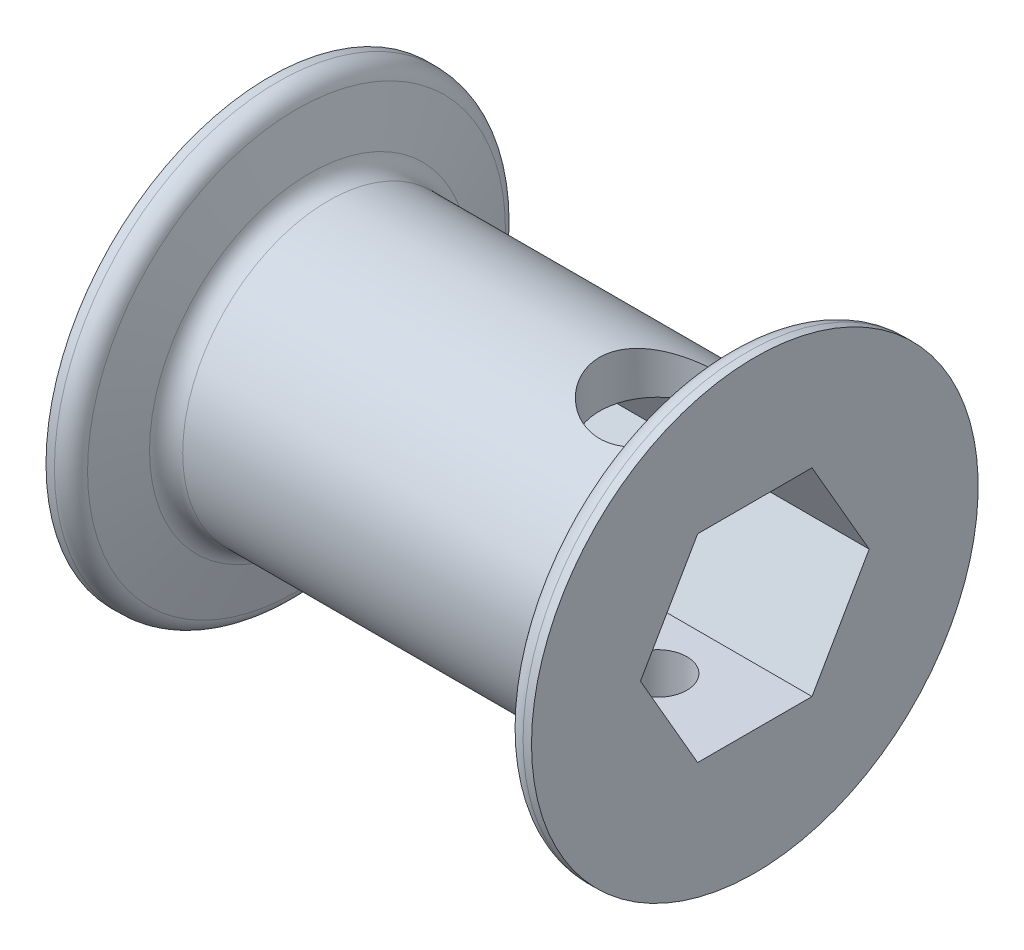
ISO-10303-21;
HEADER;
FILE_DESCRIPTION(('STEP AP214'),'2;1');
FILE_NAME('part.step','',(''),(''),'','','');
FILE_SCHEMA(('AUTOMOTIVE_DESIGN { 1 0 10303 214 1 1 1 1 }'));
ENDSEC;
DATA;
#1=APPLICATION_CONTEXT('core data for automotive mechanical design processes');
#2=APPLICATION_PROTOCOL_DEFINITION('international standard','automotive_design',2000,#1);
#3=PRODUCT_CONTEXT('',#1,'mechanical');
#4=PRODUCT('Part','Part','',(#3));
#5=PRODUCT_RELATED_PRODUCT_CATEGORY('part','',(#4));
#6=PRODUCT_DEFINITION_FORMATION('','',#4);
#7=PRODUCT_DEFINITION_CONTEXT('part definition',#1,'design');
#8=PRODUCT_DEFINITION('design','',#6,#7);
#9=PRODUCT_DEFINITION_SHAPE('','',#8);
#10=(LENGTH_UNIT() NAMED_UNIT(*) SI_UNIT(.MILLI.,.METRE.));
#11=(NAMED_UNIT(*) PLANE_ANGLE_UNIT() SI_UNIT($,.RADIAN.));
#12=(NAMED_UNIT(*) SI_UNIT($,.STERADIAN.) SOLID_ANGLE_UNIT());
#13=UNCERTAINTY_MEASURE_WITH_UNIT(LENGTH_MEASURE(1.E-05),#10,'distance_accuracy_value','');
#14=(GEOMETRIC_REPRESENTATION_CONTEXT(3) GLOBAL_UNCERTAINTY_ASSIGNED_CONTEXT((#13)) GLOBAL_UNIT_ASSIGNED_CONTEXT((#10,
#11,#12)) REPRESENTATION_CONTEXT('',''));
#15=CARTESIAN_POINT('',(0.,0.,0.));
#16=DIRECTION('',(0.,0.,1.));
#17=DIRECTION('',(1.,0.,0.));
#18=AXIS2_PLACEMENT_3D('',#15,#16,#17);
#19=CARTESIAN_POINT('',(31.75,6.477,3.7394976935412));
#20=DIRECTION('',(0.,1.,0.));
#21=DIRECTION('',(0.,0.,1.));
#22=AXIS2_PLACEMENT_3D('',#19,#20,#21);
#23=PLANE('',#22);
#24=DIRECTION('',(-1.,0.,0.));
#25=VECTOR('',#24,1.);
#26=CARTESIAN_POINT('',(31.75,6.477,3.7394976935412));
#27=LINE('',#26,#25);
#28=CARTESIAN_POINT('',(31.75,6.477,3.7394976935412));
#29=VERTEX_POINT('',#28);
#30=CARTESIAN_POINT('',(26.1295594561103,6.477,3.7394976935412));
#31=VERTEX_POINT('',#30);
#32=EDGE_CURVE('E243',#29,#31,#27,.T.);
#33=ORIENTED_EDGE('',*,*,#32,.T.);
#34=CARTESIAN_POINT('',(25.4,6.477,0.));
#35=DIRECTION('',(0.,1.,0.));
#36=DIRECTION('',(0.,0.,1.));
#37=AXIS2_PLACEMENT_3D('',#34,#35,#36);
#38=CIRCLE('',#37,3.81);
#39=CARTESIAN_POINT('',(26.1295594561103,6.477,-3.73949769354121));
#40=VERTEX_POINT('',#39);
#41=EDGE_CURVE('E54',#31,#40,#38,.T.);
#42=ORIENTED_EDGE('',*,*,#41,.T.);
#43=DIRECTION('',(-1.,0.,0.));
#44=VECTOR('',#43,1.);
#45=CARTESIAN_POINT('',(31.75,6.477,-3.73949769354121));
#46=LINE('',#45,#44);
#47=CARTESIAN_POINT('',(31.75,6.477,-3.73949769354121));
#48=VERTEX_POINT('',#47);
#49=EDGE_CURVE('E239',#48,#40,#46,.T.);
#50=ORIENTED_EDGE('',*,*,#49,.F.);
#51=DIRECTION('',(0.,0.,-1.));
#52=VECTOR('',#51,1.);
#53=CARTESIAN_POINT('',(31.75,6.477,3.7394976935412));
#54=LINE('',#53,#52);
#55=EDGE_CURVE('E204',#29,#48,#54,.T.);
#56=ORIENTED_EDGE('',*,*,#55,.F.);
#57=EDGE_LOOP('',(#33,#42,#50,#56));
#58=FACE_BOUND('',#57,.T.);
#59=ADVANCED_FACE('F37',(#58),#23,.F.);
#60=CARTESIAN_POINT('',(0.,14.605,0.));
#61=DIRECTION('',(1.,0.,0.));
#62=DIRECTION('',(0.,0.,-1.));
#63=AXIS2_PLACEMENT_3D('',#60,#61,#62);
#64=PLANE('',#63);
#65=DIRECTION('',(0.,0.866025403784438,-0.5));
#66=VECTOR('',#65,1.);
#67=CARTESIAN_POINT('',(0.,0.,7.47899538708241));
#68=LINE('',#67,#66);
#69=CARTESIAN_POINT('',(0.,0.,7.47899538708241));
#70=VERTEX_POINT('',#69);
#71=CARTESIAN_POINT('',(0.,6.477,3.7394976935412));
#72=VERTEX_POINT('',#71);
#73=EDGE_CURVE('E218',#70,#72,#68,.T.);
#74=ORIENTED_EDGE('',*,*,#73,.F.);
#75=DIRECTION('',(0.,0.866025403784439,0.5));
#76=VECTOR('',#75,1.);
#77=CARTESIAN_POINT('',(0.,-6.477,3.73949769354121));
#78=LINE('',#77,#76);
#79=CARTESIAN_POINT('',(0.,-6.477,3.73949769354121));
#80=VERTEX_POINT('',#79);
#81=EDGE_CURVE('E194',#80,#70,#78,.T.);
#82=ORIENTED_EDGE('',*,*,#81,.F.);
#83=DIRECTION('',(0.,0.,1.));
#84=VECTOR('',#83,1.);
#85=CARTESIAN_POINT('',(0.,-6.477,-3.73949769354121));
#86=LINE('',#85,#84);
#87=CARTESIAN_POINT('',(0.,-6.477,-3.73949769354121));
#88=VERTEX_POINT('',#87);
#89=EDGE_CURVE('E201',#88,#80,#86,.T.);
#90=ORIENTED_EDGE('',*,*,#89,.F.);
#91=DIRECTION('',(0.,-0.866025403784439,0.5));
#92=VECTOR('',#91,1.);
#93=CARTESIAN_POINT('',(0.,0.,-7.47899538708241));
#94=LINE('',#93,#92);
#95=CARTESIAN_POINT('',(0.,0.,-7.47899538708241));
#96=VERTEX_POINT('',#95);
#97=EDGE_CURVE('E227',#96,#88,#94,.T.);
#98=ORIENTED_EDGE('',*,*,#97,.F.);
#99=DIRECTION('',(0.,-0.866025403784439,-0.5));
#100=VECTOR('',#99,1.);
#101=CARTESIAN_POINT('',(0.,6.477,-3.73949769354121));
#102=LINE('',#101,#100);
#103=CARTESIAN_POINT('',(0.,6.477,-3.73949769354121));
#104=VERTEX_POINT('',#103);
#105=EDGE_CURVE('E224',#104,#96,#102,.T.);
#106=ORIENTED_EDGE('',*,*,#105,.F.);
#107=DIRECTION('',(0.,0.,-1.));
#108=VECTOR('',#107,1.);
#109=CARTESIAN_POINT('',(0.,6.477,3.7394976935412));
#110=LINE('',#109,#108);
#111=EDGE_CURVE('E221',#72,#104,#110,.T.);
#112=ORIENTED_EDGE('',*,*,#111,.F.);
#113=EDGE_LOOP('',(#74,#82,#90,#98,#106,#112));
#114=FACE_BOUND('',#113,.T.);
#115=CARTESIAN_POINT('',(0.,0.,0.));
#116=DIRECTION('',(-1.,0.,0.));
#117=DIRECTION('',(0.,0.,1.));
#118=AXIS2_PLACEMENT_3D('',#115,#116,#117);
#119=CIRCLE('',#118,14.605);
#120=CARTESIAN_POINT('',(0.,0.,14.605));
#121=VERTEX_POINT('',#120);
#122=EDGE_CURVE('E234',#121,#121,#119,.T.);
#123=ORIENTED_EDGE('',*,*,#122,.T.);
#124=EDGE_LOOP('',(#123));
#125=FACE_BOUND('',#124,.T.);
#126=ADVANCED_FACE('F271',(#114,#125),#64,.F.);
#127=CARTESIAN_POINT('',(31.75,0.,0.));
#128=DIRECTION('',(-1.,0.,0.));
#129=DIRECTION('',(0.,0.,1.));
#130=AXIS2_PLACEMENT_3D('',#127,#128,#129);
#131=PLANE('',#130);
#132=DIRECTION('',(0.,0.,1.));
#133=VECTOR('',#132,1.);
#134=CARTESIAN_POINT('',(31.75,-6.477,-3.73949769354121));
#135=LINE('',#134,#133);
#136=CARTESIAN_POINT('',(31.75,-6.477,-3.73949769354121));
#137=VERTEX_POINT('',#136);
#138=CARTESIAN_POINT('',(31.75,-6.477,3.73949769354121));
#139=VERTEX_POINT('',#138);
#140=EDGE_CURVE('E213',#137,#139,#135,.T.);
#141=ORIENTED_EDGE('',*,*,#140,.T.);
#142=DIRECTION('',(0.,0.866025403784439,0.5));
#143=VECTOR('',#142,1.);
#144=CARTESIAN_POINT('',(31.75,-6.477,3.73949769354121));
#145=LINE('',#144,#143);
#146=CARTESIAN_POINT('',(31.75,0.,7.47899538708241));
#147=VERTEX_POINT('',#146);
#148=EDGE_CURVE('E197',#139,#147,#145,.T.);
#149=ORIENTED_EDGE('',*,*,#148,.T.);
#150=DIRECTION('',(0.,0.866025403784438,-0.5));
#151=VECTOR('',#150,1.);
#152=CARTESIAN_POINT('',(31.75,0.,7.47899538708241));
#153=LINE('',#152,#151);
#154=EDGE_CURVE('E200',#147,#29,#153,.T.);
#155=ORIENTED_EDGE('',*,*,#154,.T.);
#156=ORIENTED_EDGE('',*,*,#55,.T.);
#157=DIRECTION('',(0.,-0.866025403784439,-0.5));
#158=VECTOR('',#157,1.);
#159=CARTESIAN_POINT('',(31.75,6.477,-3.73949769354121));
#160=LINE('',#159,#158);
#161=CARTESIAN_POINT('',(31.75,0.,-7.47899538708241));
#162=VERTEX_POINT('',#161);
#163=EDGE_CURVE('E207',#48,#162,#160,.T.);
#164=ORIENTED_EDGE('',*,*,#163,.T.);
#165=DIRECTION('',(0.,-0.866025403784439,0.5));
#166=VECTOR('',#165,1.);
#167=CARTESIAN_POINT('',(31.75,0.,-7.47899538708241));
#168=LINE('',#167,#166);
#169=EDGE_CURVE('E210',#162,#137,#168,.T.);
#170=ORIENTED_EDGE('',*,*,#169,.T.);
#171=EDGE_LOOP('',(#141,#149,#155,#156,#164,#170));
#172=FACE_BOUND('',#171,.T.);
#173=CARTESIAN_POINT('',(31.75,0.,0.));
#174=DIRECTION('',(-1.,0.,0.));
#175=DIRECTION('',(0.,0.,1.));
#176=AXIS2_PLACEMENT_3D('',#173,#174,#175);
#177=CIRCLE('',#176,14.605);
#178=CARTESIAN_POINT('',(31.75,0.,14.605));
#179=VERTEX_POINT('',#178);
#180=EDGE_CURVE('E251',#179,#179,#177,.T.);
#181=ORIENTED_EDGE('',*,*,#180,.F.);
#182=EDGE_LOOP('',(#181));
#183=FACE_BOUND('',#182,.T.);
#184=ADVANCED_FACE('F273',(#172,#183),#131,.F.);
#185=CARTESIAN_POINT('',(31.75,0.,0.));
#186=DIRECTION('',(-1.,0.,0.));
#187=DIRECTION('',(0.,0.,1.));
#188=AXIS2_PLACEMENT_3D('',#185,#186,#187);
#189=CYLINDRICAL_SURFACE('',#188,14.605);
#190=CARTESIAN_POINT('',(31.2005052747333,0.,0.));
#191=DIRECTION('',(1.,0.,0.));
#192=DIRECTION('',(0.,0.,-1.));
#193=AXIS2_PLACEMENT_3D('',#190,#191,#192);
#194=CIRCLE('',#193,14.605);
#195=CARTESIAN_POINT('',(31.2005052747333,0.,-14.605));
#196=VERTEX_POINT('',#195);
#197=EDGE_CURVE('E120',#196,#196,#194,.T.);
#198=ORIENTED_EDGE('',*,*,#197,.T.);
#199=EDGE_LOOP('',(#198));
#200=FACE_BOUND('',#199,.T.);
#201=ORIENTED_EDGE('',*,*,#180,.T.);
#202=EDGE_LOOP('',(#201));
#203=FACE_BOUND('',#202,.T.);
#204=ADVANCED_FACE('F280',(#200,#203),#189,.T.);
#205=CARTESIAN_POINT('',(30.226,0.,0.));
#206=DIRECTION('',(1.,0.,0.));
#207=DIRECTION('',(0.,0.,-1.));
#208=AXIS2_PLACEMENT_3D('',#205,#206,#207);
#209=CONICAL_SURFACE('',#208,14.605,1.30899693899575);
#210=CARTESIAN_POINT('',(29.9737794753462,0.,0.));
#211=DIRECTION('',(-1.,0.,0.));
#212=DIRECTION('',(0.,0.,1.));
#213=AXIS2_PLACEMENT_3D('',#210,#211,#212);
#214=CIRCLE('',#213,13.6637001872802);
#215=CARTESIAN_POINT('',(29.9737794753462,0.,13.6637001872802));
#216=VERTEX_POINT('',#215);
#217=EDGE_CURVE('E142',#216,#216,#214,.T.);
#218=ORIENTED_EDGE('',*,*,#217,.T.);
#219=EDGE_LOOP('',(#218));
#220=FACE_BOUND('',#219,.T.);
#221=CARTESIAN_POINT('',(29.1170386271038,0.,0.));
#222=DIRECTION('',(1.,0.,0.));
#223=DIRECTION('',(0.,0.,-1.));
#224=AXIS2_PLACEMENT_3D('',#221,#222,#223);
#225=CIRCLE('',#224,10.4662998127198);
#226=CARTESIAN_POINT('',(29.1170386271038,10.4328187909654,0.836494975847781));
#227=VERTEX_POINT('',#226);
#228=CARTESIAN_POINT('',(29.1170386271038,10.4328187909653,-0.836494975848145));
#229=VERTEX_POINT('',#228);
#230=EDGE_CURVE('E140',#227,#229,#225,.T.);
#231=ORIENTED_EDGE('',*,*,#230,.T.);
#232=CARTESIAN_POINT('',(29.1075424898141,10.3938735008649,-0.877626735134432));
#233=CARTESIAN_POINT('',(29.1194316101568,10.4426445168741,-0.827290437817893));
#234=CARTESIAN_POINT('',(29.1308562368773,10.489468469231,-0.774555005238325));
#235=CARTESIAN_POINT('',(29.1523767545899,10.5776148543173,-0.662674139751302));
#236=CARTESIAN_POINT('',(29.1624407277926,10.618805333962,-0.603419753804488));
#237=CARTESIAN_POINT('',(29.1803809447071,10.6921953796841,-0.478357105689738));
#238=CARTESIAN_POINT('',(29.188237189866,10.7243127707729,-0.412495834570957));
#239=CARTESIAN_POINT('',(29.2006093543414,10.7748773211094,-0.275842251486407));
#240=CARTESIAN_POINT('',(29.2051544056047,10.7934437051104,-0.205099090984313));
#241=CARTESIAN_POINT('',(29.2094811075277,10.8111172267792,-0.0814807061289831));
#242=CARTESIAN_POINT('',(29.2102459285749,10.8142408408232,-0.0292058852926305));
#243=CARTESIAN_POINT('',(29.2096156403943,10.8116665101706,0.0751369869985414));
#244=CARTESIAN_POINT('',(29.2082197857198,10.80596552093,0.127204960875704));
#245=CARTESIAN_POINT('',(29.2034362901259,10.786424513685,0.22929437035956));
#246=CARTESIAN_POINT('',(29.2000616561455,10.7726376457653,0.279326909515469));
#247=CARTESIAN_POINT('',(29.1916227153684,10.7381501619828,0.376972138531155));
#248=CARTESIAN_POINT('',(29.1865516625594,10.7174219426615,0.424574278362822));
#249=CARTESIAN_POINT('',(29.1713354535369,10.6551993496216,0.546862530021448));
#250=CARTESIAN_POINT('',(29.160038951456,10.6089821594954,0.618943268608606));
#251=CARTESIAN_POINT('',(29.1351876581554,10.5072199482101,0.754366985257721));
#252=CARTESIAN_POINT('',(29.1216646771832,10.4518062415131,0.817812829358654));
#253=CARTESIAN_POINT('',(29.1075424898138,10.3938735008635,0.877626735135936));
#254=B_SPLINE_CURVE_WITH_KNOTS('',3,(#232,#233,#234,#235,#236,#237,#238,#239,#240,#241,#242,
#243,#244,#245,#246,#247,#248,#249,#250,#251,#252,#253),.UNSPECIFIED.,.F.,.F.,(4,2,2,2,2,2,2,2,
2,2,4),(0.,0.213639439252331,0.431643919142741,0.65156381270545,0.869524677953614,
1.02588844047303,1.1823061615033,1.33770706200932,1.49373342781202,1.75161487794954,
2.00608901191679),.UNSPECIFIED.);
#255=EDGE_CURVE('E62',#229,#227,#254,.T.);
#256=ORIENTED_EDGE('',*,*,#255,.T.);
#257=EDGE_LOOP('',(#231,#256));
#258=FACE_BOUND('',#257,.T.);
#259=ADVANCED_FACE('F180',(#220,#258),#209,.T.);
#260=CARTESIAN_POINT('',(31.75,0.,0.));
#261=DIRECTION('',(-1.,0.,0.));
#262=DIRECTION('',(0.,0.,1.));
#263=AXIS2_PLACEMENT_3D('',#260,#261,#262);
#264=CYLINDRICAL_SURFACE('',#263,9.525);
#265=CARTESIAN_POINT('',(25.4,-9.33255592000391,-1.905));
#266=CARTESIAN_POINT('',(25.2941498646893,-9.33255802445761,-1.90499608689239));
#267=CARTESIAN_POINT('',(25.18825044255,-9.33437633251877,-1.89614779212306));
#268=CARTESIAN_POINT('',(24.9794474277023,-9.34144241635786,-1.86101790022531));
#269=CARTESIAN_POINT('',(24.8765463009685,-9.3466929362082,-1.83472235366929));
#270=CARTESIAN_POINT('',(24.6767909371102,-9.36000554440133,-1.76554596589061));
#271=CARTESIAN_POINT('',(24.5799307964804,-9.36806483548149,-1.72268162096074));
#272=CARTESIAN_POINT('',(24.3947794208523,-9.38608358010655,-1.62162955011231));
#273=CARTESIAN_POINT('',(24.3064877079753,-9.39604292758943,-1.56344267943519));
#274=CARTESIAN_POINT('',(24.1397262876584,-9.41689695917551,-1.43252013911979));
#275=CARTESIAN_POINT('',(24.061395385081,-9.42780190579954,-1.35960927451487));
#276=CARTESIAN_POINT('',(23.917990898532,-9.4492280973645,-1.20168693308559));
#277=CARTESIAN_POINT('',(23.8529182438703,-9.45974931536634,-1.11667460874306));
#278=CARTESIAN_POINT('',(23.7373388264178,-9.47933327175455,-0.936043383035706));
#279=CARTESIAN_POINT('',(23.6869639661793,-9.48838249846154,-0.840338491415561));
#280=CARTESIAN_POINT('',(23.6030612449233,-9.50388758763318,-0.641611906487753));
#281=CARTESIAN_POINT('',(23.5695318069286,-9.51034369284047,-0.538590899106154));
#282=CARTESIAN_POINT('',(23.5207037961546,-9.51986260911437,-0.329596953095532));
#283=CARTESIAN_POINT('',(23.5051708377272,-9.52296900878882,-0.223680793204221));
#284=CARTESIAN_POINT('',(23.492045436748,-9.52558904854765,-0.0107033728735072));
#285=CARTESIAN_POINT('',(23.4944512654247,-9.52510303483506,0.0963577762296605));
#286=CARTESIAN_POINT('',(23.5169573733106,-9.52062678424522,0.306975511416535));
#287=CARTESIAN_POINT('',(23.5368051815048,-9.51668654886922,0.410560293238584));
#288=CARTESIAN_POINT('',(23.5932313868342,-9.50580097488673,0.612898748635472));
#289=CARTESIAN_POINT('',(23.6298104533755,-9.49885551604394,0.71165222873828));
#290=CARTESIAN_POINT('',(23.7188947264805,-9.48265748918021,0.902245077397689));
#291=CARTESIAN_POINT('',(23.7714988458548,-9.47339065773801,0.994036951725077));
#292=CARTESIAN_POINT('',(23.8910667921357,-9.45357144347561,1.16758411236283));
#293=CARTESIAN_POINT('',(23.9580322713628,-9.44301891279198,1.24933824209512));
#294=CARTESIAN_POINT('',(24.1058070501166,-9.42157687114295,1.40198747615683));
#295=CARTESIAN_POINT('',(24.1868373007199,-9.41068469251568,1.47266847307276));
#296=CARTESIAN_POINT('',(24.3597108228687,-9.38996543895639,1.59947322950181));
#297=CARTESIAN_POINT('',(24.4515542988825,-9.38013838417164,1.65559671368136));
#298=CARTESIAN_POINT('',(24.6437546846205,-9.3626568043592,1.75176716219758));
#299=CARTESIAN_POINT('',(24.7441293933536,-9.35500697378561,1.79177946401653));
#300=CARTESIAN_POINT('',(24.9503653716942,-9.34281487392025,1.85430860080054));
#301=CARTESIAN_POINT('',(25.0562259243144,-9.33827219962655,1.8768277159649));
#302=CARTESIAN_POINT('',(25.2684880544882,-9.33288988005211,1.90341124149867));
#303=CARTESIAN_POINT('',(25.3748493790612,-9.33198820143879,1.90778484120052));
#304=CARTESIAN_POINT('',(25.5867818651954,-9.33382345237267,1.89878518193195));
#305=CARTESIAN_POINT('',(25.6923530712214,-9.33656017559239,1.88541292929825));
#306=CARTESIAN_POINT('',(25.8986692597567,-9.34530577902812,1.84156770638126));
#307=CARTESIAN_POINT('',(25.9994508134831,-9.35128303122616,1.81125994269886));
#308=CARTESIAN_POINT('',(26.1945055465498,-9.36580847214921,1.73458067226272));
#309=CARTESIAN_POINT('',(26.2887781889801,-9.37435687265343,1.6882078422209));
#310=CARTESIAN_POINT('',(26.4694919744551,-9.39320078357685,1.58001489092071));
#311=CARTESIAN_POINT('',(26.5558150232031,-9.4035176140264,1.51800130355714));
#312=CARTESIAN_POINT('',(26.7169423343617,-9.42467743889742,1.38054506506521));
#313=CARTESIAN_POINT('',(26.7917454097648,-9.43552048738873,1.30510103180034));
#314=CARTESIAN_POINT('',(26.9288816752485,-9.45671233880856,1.14153748101348));
#315=CARTESIAN_POINT('',(26.9910058121082,-9.46705099935042,1.05324116046094));
#316=CARTESIAN_POINT('',(27.0995379042567,-9.48589278132521,0.867285343089206));
#317=CARTESIAN_POINT('',(27.1459465195518,-9.49439597983677,0.769626239700828));
#318=CARTESIAN_POINT('',(27.2214255006773,-9.50856545186331,0.568266606969743));
#319=CARTESIAN_POINT('',(27.250594187221,-9.51424778266658,0.464604112975738));
#320=CARTESIAN_POINT('',(27.2910768267996,-9.52220414461245,0.25372591116523));
#321=CARTESIAN_POINT('',(27.3023929303012,-9.52447858625712,0.146510632894857));
#322=CARTESIAN_POINT('',(27.3067658987343,-9.52535319565089,-0.066432862886399));
#323=CARTESIAN_POINT('',(27.3001370692691,-9.52401661136473,-0.172154492129547));
#324=CARTESIAN_POINT('',(27.2695023242064,-9.51795232982446,-0.380944814656313));
#325=CARTESIAN_POINT('',(27.2454966271068,-9.51322467520991,-0.484013541280841));
#326=CARTESIAN_POINT('',(27.1809292700655,-9.50091124385174,-0.684376488264348));
#327=CARTESIAN_POINT('',(27.1404053746605,-9.49333198956706,-0.781683304372512));
#328=CARTESIAN_POINT('',(27.0439916802642,-9.4761314564561,-0.96816142445446));
#329=CARTESIAN_POINT('',(26.9881006670019,-9.46651001627512,-1.05733208478774));
#330=CARTESIAN_POINT('',(26.8614790676482,-9.4460872639359,-1.22656071065177));
#331=CARTESIAN_POINT('',(26.7905236291889,-9.43526942161101,-1.30644845919877));
#332=CARTESIAN_POINT('',(26.6362492926118,-9.41377129639483,-1.45329138682995));
#333=CARTESIAN_POINT('',(26.5529274703407,-9.4030910466896,-1.52024349851298));
#334=CARTESIAN_POINT('',(26.3752089017047,-9.38295067908139,-1.63999967805221));
#335=CARTESIAN_POINT('',(26.280702529064,-9.37350494303185,-1.69264358184746));
#336=CARTESIAN_POINT('',(26.0840230669395,-9.35707876725817,-1.78122081385216));
#337=CARTESIAN_POINT('',(25.9818570303009,-9.35009609260094,-1.81716930058078));
#338=CARTESIAN_POINT('',(25.7995500223813,-9.34078042567595,-1.86436471142883));
#339=CARTESIAN_POINT('',(25.7204487758259,-9.33771535262325,-1.87957567668762));
#340=CARTESIAN_POINT('',(25.5609078165801,-9.33360233464556,-1.89989463421325));
#341=CARTESIAN_POINT('',(25.4804681501293,-9.33255432018076,-1.90500297477683));
#342=CARTESIAN_POINT('',(25.4,-9.33255592000391,-1.905));
#343=B_SPLINE_CURVE_WITH_KNOTS('',3,(#265,#266,#267,#268,#269,#270,#271,#272,#273,#274,#275,
#276,#277,#278,#279,#280,#281,#282,#283,#284,#285,#286,#287,#288,#289,#290,#291,#292,#293,#294,
#295,#296,#297,#298,#299,#300,#301,#302,#303,#304,#305,#306,#307,#308,#309,#310,#311,#312,#313,
#314,#315,#316,#317,#318,#319,#320,#321,#322,#323,#324,#325,#326,#327,#328,#329,#330,#331,#332,
#333,#334,#335,#336,#337,#338,#339,#340,#341,#342),.UNSPECIFIED.,.T.,.F.,(4,2,2,2,2,2,2,2,2,2,2,
2,2,2,2,2,2,2,2,2,2,2,2,2,2,2,2,2,2,2,2,2,2,2,2,2,2,2,4),(0.,0.317255773671261,
0.634765505836584,0.951959928576815,1.26913665055804,1.59033691104771,1.91155967767478,
2.23558227833342,2.55957454009696,2.87929794122268,3.19899053081452,3.51413044251888,
3.82928296385494,4.14642155643487,4.46359665641975,4.7863000558253,5.10900955823781,
5.43240969344139,5.75576766705527,6.0735925861775,6.39139948276642,6.70615896097222,
7.02094437225128,7.33983278870462,7.65875404117747,7.98257106302223,8.30637448380348,
8.62831294867327,8.9502126308755,9.26651088174975,9.5828051555367,9.89838032528734,
10.2139804381657,10.5346719460876,10.8554394058503,11.1796620179415,11.5035896754683,
11.744778459307,11.9859589278084),.UNSPECIFIED.);
#344=CARTESIAN_POINT('',(25.4,-9.33255592000391,-1.905));
#345=VERTEX_POINT('',#344);
#346=EDGE_CURVE('E187',#345,#345,#343,.T.);
#347=ORIENTED_EDGE('',*,*,#346,.T.);
#348=EDGE_LOOP('',(#347));
#349=FACE_BOUND('',#348,.T.);
#350=CARTESIAN_POINT('',(3.85968717228335,0.,0.));
#351=DIRECTION('',(-1.,0.,0.));
#352=DIRECTION('',(0.,0.,1.));
#353=AXIS2_PLACEMENT_3D('',#350,#351,#352);
#354=CIRCLE('',#353,9.525);
#355=CARTESIAN_POINT('',(3.85968717228335,0.,9.525));
#356=VERTEX_POINT('',#355);
#357=EDGE_CURVE('E127',#356,#356,#354,.F.);
#358=ORIENTED_EDGE('',*,*,#357,.T.);
#359=EDGE_LOOP('',(#358));
#360=FACE_BOUND('',#359,.T.);
#361=CARTESIAN_POINT('',(27.8903128277166,0.,0.));
#362=DIRECTION('',(-1.,0.,0.));
#363=DIRECTION('',(0.,0.,1.));
#364=AXIS2_PLACEMENT_3D('',#361,#362,#363);
#365=CIRCLE('',#364,9.525);
#366=CARTESIAN_POINT('',(27.8903128277166,9.07806052964454,-2.88347741799896));
#367=VERTEX_POINT('',#366);
#368=CARTESIAN_POINT('',(27.8903128277166,9.07806052964454,2.88347741799896));
#369=VERTEX_POINT('',#368);
#370=EDGE_CURVE('E125',#367,#369,#365,.T.);
#371=ORIENTED_EDGE('',*,*,#370,.T.);
#372=CARTESIAN_POINT('',(27.8903128277166,9.07806052964454,2.88347741799896));
#373=CARTESIAN_POINT('',(27.8113232864665,9.05639470493108,2.95168821777608));
#374=CARTESIAN_POINT('',(27.7295435458638,9.03491242292672,3.01665623846379));
#375=CARTESIAN_POINT('',(27.5607476682792,8.99286656339521,3.13977818625046));
#376=CARTESIAN_POINT('',(27.473730014056,8.97230325509752,3.19793012445136));
#377=CARTESIAN_POINT('',(27.2050751416564,8.91276492459255,3.36181492473227));
#378=CARTESIAN_POINT('',(27.0161328392902,8.87602633640992,3.4567201501288));
#379=CARTESIAN_POINT('',(26.6231705684551,8.81294604338806,3.61454257567275));
#380=CARTESIAN_POINT('',(26.4191150347158,8.78662985145342,3.67738138773579));
#381=CARTESIAN_POINT('',(26.0023604452305,8.74811514600904,3.76810164998368));
#382=CARTESIAN_POINT('',(25.7896777494786,8.73589109590812,3.79604634002299));
#383=CARTESIAN_POINT('',(25.3741943925884,8.72750973529142,3.81526983744759));
#384=CARTESIAN_POINT('',(25.1714986425645,8.73050025523027,3.80849323189757));
#385=CARTESIAN_POINT('',(24.7703272007201,8.75019088842515,3.76302822184758));
#386=CARTESIAN_POINT('',(24.571853506439,8.76689734920599,3.72432504218448));
#387=CARTESIAN_POINT('',(24.1886415904157,8.81143218034293,3.61766613484838));
#388=CARTESIAN_POINT('',(24.0037085276976,8.83903240135147,3.5503084016114));
#389=CARTESIAN_POINT('',(23.6475193630723,8.90224336404899,3.38868534482295));
#390=CARTESIAN_POINT('',(23.4762656008217,8.93785547210288,3.29441543087042));
#391=CARTESIAN_POINT('',(23.139667364732,9.01609660705483,3.07411343496483));
#392=CARTESIAN_POINT('',(22.9755291840477,9.05903904189034,2.94634930447873));
#393=CARTESIAN_POINT('',(22.6701862490865,9.14548647689323,2.66593638178454));
#394=CARTESIAN_POINT('',(22.528991067175,9.18899170373981,2.51327725574184));
#395=CARTESIAN_POINT('',(22.2660372832545,9.27442457469416,2.17765379059506));
#396=CARTESIAN_POINT('',(22.1457078109727,9.31614597361584,1.99351112121579));
#397=CARTESIAN_POINT('',(21.9379706607368,9.39072642384526,1.60585342727388));
#398=CARTESIAN_POINT('',(21.8505532245607,9.42358810118588,1.40234416724398));
#399=CARTESIAN_POINT('',(21.7144639937738,9.47569948963157,0.989200725672979));
#400=CARTESIAN_POINT('',(21.6645248383037,9.49539172509158,0.780041753936511));
#401=CARTESIAN_POINT('',(21.6005601705234,9.52073416730218,0.355500460149753));
#402=CARTESIAN_POINT('',(21.5865184062769,9.52639072843266,0.140120999001288));
#403=CARTESIAN_POINT('',(21.5946853582634,9.52312769176173,-0.27621723995384));
#404=CARTESIAN_POINT('',(21.6146696975598,9.51510246489896,-0.477231031353309));
#405=CARTESIAN_POINT('',(21.6858675894473,9.48700376011102,-0.872753789661131));
#406=CARTESIAN_POINT('',(21.7370815477479,9.46693012566293,-1.06726267202843));
#407=CARTESIAN_POINT('',(21.8688759527917,9.41672279174685,-1.44473903008153));
#408=CARTESIAN_POINT('',(21.9494724369474,9.38658359910529,-1.62770013872322));
#409=CARTESIAN_POINT('',(22.1375028908993,9.31910538205109,-1.97780950189716));
#410=CARTESIAN_POINT('',(22.2449447658709,9.28176423761621,-2.14495307860871));
#411=CARTESIAN_POINT('',(22.4913276040412,9.20084503543944,-2.46977952011196));
#412=CARTESIAN_POINT('',(22.6318073654648,9.1570239291892,-2.62623521057435));
#413=CARTESIAN_POINT('',(22.9365967725337,9.0695417178107,-2.91405401975093));
#414=CARTESIAN_POINT('',(23.1009156897124,9.02588068174189,-3.04540732936734));
#415=CARTESIAN_POINT('',(23.4571726772823,8.94164191545864,-3.28473183966771));
#416=CARTESIAN_POINT('',(23.6499822099473,8.90127134649786,-3.39148600051843));
#417=CARTESIAN_POINT('',(24.0527306249343,8.83093911137833,-3.57064099210599));
#418=CARTESIAN_POINT('',(24.2626625758996,8.80097325884043,-3.64305564378044));
#419=CARTESIAN_POINT('',(24.6832257469472,8.75680912236833,-3.74793765676831));
#420=CARTESIAN_POINT('',(24.8933508256611,8.74192994830986,-3.78213795429484));
#421=CARTESIAN_POINT('',(25.3167712646922,8.72764519829211,-3.81499598781694));
#422=CARTESIAN_POINT('',(25.53006395808,8.72822726961574,-3.81368209775479));
#423=CARTESIAN_POINT('',(25.9382674514222,8.74416730532974,-3.77696604029799));
#424=CARTESIAN_POINT('',(26.1334355818507,8.7585090127553,-3.74390826155071));
#425=CARTESIAN_POINT('',(26.5153672031864,8.79871661022838,-3.64840723323495));
#426=CARTESIAN_POINT('',(26.7021208041216,8.82459569066933,-3.58593034491657));
#427=CARTESIAN_POINT('',(27.0665884679336,8.88560810126849,-3.43198833212015));
#428=CARTESIAN_POINT('',(27.2440178131265,8.92093035601058,-3.33992263393623));
#429=CARTESIAN_POINT('',(27.4968665465031,8.97772816446689,-3.182627266464));
#430=CARTESIAN_POINT('',(27.5788871240661,8.99728328338902,-3.12703616075669));
#431=CARTESIAN_POINT('',(27.7382098659718,9.03719107023021,-3.00975736616127));
#432=CARTESIAN_POINT('',(27.8155132196415,9.05754353497634,-2.94807122433899));
#433=CARTESIAN_POINT('',(27.8903128277166,9.07806052964454,-2.88347741799896));
#434=B_SPLINE_CURVE_WITH_KNOTS('',3,(#372,#373,#374,#375,#376,#377,#378,#379,#380,#381,#382,
#383,#384,#385,#386,#387,#388,#389,#390,#391,#392,#393,#394,#395,#396,#397,#398,#399,#400,#401,
#402,#403,#404,#405,#406,#407,#408,#409,#410,#411,#412,#413,#414,#415,#416,#417,#418,#419,#420,
#421,#422,#423,#424,#425,#426,#427,#428,#429,#430,#431,#432,#433),.UNSPECIFIED.,.F.,.F.,(4,2,2,
2,2,2,2,2,2,2,2,2,2,2,2,2,2,2,2,2,2,2,2,2,2,2,2,2,2,2,4),(0.,0.319591258139994,
0.639275540437165,1.27983410831945,1.92195114391605,2.56290275099993,3.16836351197023,
3.77410462884389,4.36778083808438,4.96155837102885,5.59596803110004,6.23064170610071,
6.898996864136,7.56715370250801,8.21154869853001,8.8556519039173,9.45924518871287,
10.0628463150625,10.6667773901995,11.2708865152441,11.912412574837,12.5541888091851,
13.2229808625989,13.891503512192,14.5282950789852,15.1645778983194,15.757216363552,
16.3505341221893,16.9567482997999,17.2594825444841,17.562140144419),.UNSPECIFIED.);
#435=EDGE_CURVE('E115',#369,#367,#434,.T.);
#436=ORIENTED_EDGE('',*,*,#435,.T.);
#437=EDGE_LOOP('',(#371,#436));
#438=FACE_BOUND('',#437,.T.);
#439=ADVANCED_FACE('F124',(#349,#360,#438),#264,.T.);
#440=CARTESIAN_POINT('',(2.88518189755007,0.,0.));
#441=DIRECTION('',(-1.,0.,0.));
#442=DIRECTION('',(0.,0.,1.));
#443=AXIS2_PLACEMENT_3D('',#440,#441,#442);
#444=CONICAL_SURFACE('',#443,9.525,1.30899693899575);
#445=CARTESIAN_POINT('',(2.63296137289624,0.,0.));
#446=DIRECTION('',(-1.,0.,0.));
#447=DIRECTION('',(0.,0.,1.));
#448=AXIS2_PLACEMENT_3D('',#445,#446,#447);
#449=CIRCLE('',#448,10.4662998127198);
#450=CARTESIAN_POINT('',(2.63296137289624,0.,10.4662998127198));
#451=VERTEX_POINT('',#450);
#452=EDGE_CURVE('E128',#451,#451,#449,.T.);
#453=ORIENTED_EDGE('',*,*,#452,.T.);
#454=EDGE_LOOP('',(#453));
#455=FACE_BOUND('',#454,.T.);
#456=CARTESIAN_POINT('',(1.77622052465383,0.,0.));
#457=DIRECTION('',(1.,0.,0.));
#458=DIRECTION('',(0.,0.,-1.));
#459=AXIS2_PLACEMENT_3D('',#456,#457,#458);
#460=CIRCLE('',#459,13.6637001872802);
#461=CARTESIAN_POINT('',(1.77622052465383,0.,-13.6637001872802));
#462=VERTEX_POINT('',#461);
#463=EDGE_CURVE('E134',#462,#462,#460,.T.);
#464=ORIENTED_EDGE('',*,*,#463,.T.);
#465=EDGE_LOOP('',(#464));
#466=FACE_BOUND('',#465,.T.);
#467=ADVANCED_FACE('F179',(#455,#466),#444,.T.);
#468=CARTESIAN_POINT('',(31.75,0.,0.));
#469=DIRECTION('',(-1.,0.,0.));
#470=DIRECTION('',(0.,0.,1.));
#471=AXIS2_PLACEMENT_3D('',#468,#469,#470);
#472=CYLINDRICAL_SURFACE('',#471,14.605);
#473=CARTESIAN_POINT('',(0.549494725266716,0.,0.));
#474=DIRECTION('',(1.,0.,0.));
#475=DIRECTION('',(0.,0.,-1.));
#476=AXIS2_PLACEMENT_3D('',#473,#474,#475);
#477=CIRCLE('',#476,14.605);
#478=CARTESIAN_POINT('',(0.549494725266716,0.,-14.605));
#479=VERTEX_POINT('',#478);
#480=EDGE_CURVE('E131',#479,#479,#477,.F.);
#481=ORIENTED_EDGE('',*,*,#480,.T.);
#482=EDGE_LOOP('',(#481));
#483=FACE_BOUND('',#482,.T.);
#484=ORIENTED_EDGE('',*,*,#122,.F.);
#485=EDGE_LOOP('',(#484));
#486=FACE_BOUND('',#485,.T.);
#487=ADVANCED_FACE('F265',(#483,#486),#472,.T.);
#488=CARTESIAN_POINT('',(31.75,-6.477,3.73949769354121));
#489=DIRECTION('',(0.,-0.5,0.866025403784439));
#490=DIRECTION('',(0.,-0.866025403784439,-0.5));
#491=AXIS2_PLACEMENT_3D('',#488,#489,#490);
#492=PLANE('',#491);
#493=ORIENTED_EDGE('',*,*,#81,.T.);
#494=DIRECTION('',(-1.,0.,0.));
#495=VECTOR('',#494,1.);
#496=CARTESIAN_POINT('',(31.75,0.,7.47899538708241));
#497=LINE('',#496,#495);
#498=EDGE_CURVE('E216',#147,#70,#497,.T.);
#499=ORIENTED_EDGE('',*,*,#498,.F.);
#500=ORIENTED_EDGE('',*,*,#148,.F.);
#501=DIRECTION('',(-1.,0.,0.));
#502=VECTOR('',#501,1.);
#503=CARTESIAN_POINT('',(31.75,-6.477,3.73949769354121));
#504=LINE('',#503,#502);
#505=EDGE_CURVE('E232',#139,#80,#504,.T.);
#506=ORIENTED_EDGE('',*,*,#505,.T.);
#507=EDGE_LOOP('',(#493,#499,#500,#506));
#508=FACE_BOUND('',#507,.T.);
#509=ADVANCED_FACE('F268',(#508),#492,.F.);
#510=CARTESIAN_POINT('',(31.75,-6.477,-3.73949769354121));
#511=DIRECTION('',(0.,-1.,0.));
#512=DIRECTION('',(0.,0.,-1.));
#513=AXIS2_PLACEMENT_3D('',#510,#511,#512);
#514=PLANE('',#513);
#515=CARTESIAN_POINT('',(25.4,-6.477,0.));
#516=DIRECTION('',(0.,-1.,0.));
#517=DIRECTION('',(0.,0.,-1.));
#518=AXIS2_PLACEMENT_3D('',#515,#516,#517);
#519=CIRCLE('',#518,1.905);
#520=CARTESIAN_POINT('',(25.4,-6.477,-1.905));
#521=VERTEX_POINT('',#520);
#522=EDGE_CURVE('E42',#521,#521,#519,.T.);
#523=ORIENTED_EDGE('',*,*,#522,.T.);
#524=EDGE_LOOP('',(#523));
#525=FACE_BOUND('',#524,.T.);
#526=ORIENTED_EDGE('',*,*,#89,.T.);
#527=ORIENTED_EDGE('',*,*,#505,.F.);
#528=ORIENTED_EDGE('',*,*,#140,.F.);
#529=DIRECTION('',(-1.,0.,0.));
#530=VECTOR('',#529,1.);
#531=CARTESIAN_POINT('',(31.75,-6.477,-3.73949769354121));
#532=LINE('',#531,#530);
#533=EDGE_CURVE('E235',#137,#88,#532,.T.);
#534=ORIENTED_EDGE('',*,*,#533,.T.);
#535=EDGE_LOOP('',(#526,#527,#528,#534));
#536=FACE_BOUND('',#535,.T.);
#537=ADVANCED_FACE('F315',(#525,#536),#514,.F.);
#538=CARTESIAN_POINT('',(31.75,0.,-7.47899538708241));
#539=DIRECTION('',(0.,-0.5,-0.866025403784439));
#540=DIRECTION('',(0.,0.866025403784439,-0.5));
#541=AXIS2_PLACEMENT_3D('',#538,#539,#540);
#542=PLANE('',#541);
#543=ORIENTED_EDGE('',*,*,#97,.T.);
#544=ORIENTED_EDGE('',*,*,#533,.F.);
#545=ORIENTED_EDGE('',*,*,#169,.F.);
#546=DIRECTION('',(-1.,0.,0.));
#547=VECTOR('',#546,1.);
#548=CARTESIAN_POINT('',(31.75,0.,-7.47899538708241));
#549=LINE('',#548,#547);
#550=EDGE_CURVE('E237',#162,#96,#549,.T.);
#551=ORIENTED_EDGE('',*,*,#550,.T.);
#552=EDGE_LOOP('',(#543,#544,#545,#551));
#553=FACE_BOUND('',#552,.T.);
#554=ADVANCED_FACE('F352',(#553),#542,.F.);
#555=CARTESIAN_POINT('',(31.75,6.477,-3.73949769354121));
#556=DIRECTION('',(0.,0.5,-0.866025403784439));
#557=DIRECTION('',(0.,0.866025403784439,0.5));
#558=AXIS2_PLACEMENT_3D('',#555,#556,#557);
#559=PLANE('',#558);
#560=ORIENTED_EDGE('',*,*,#49,.T.);
#561=CARTESIAN_POINT('',(25.4,12.954,0.));
#562=DIRECTION('',(0.,0.5,-0.866025403784439));
#563=DIRECTION('',(0.,-0.866025403784439,-0.5));
#564=AXIS2_PLACEMENT_3D('',#561,#562,#563);
#565=ELLIPSE('',#564,7.62000000000001,3.81);
#566=CARTESIAN_POINT('',(24.6704405438897,6.477,-3.73949769354121));
#567=VERTEX_POINT('',#566);
#568=EDGE_CURVE('E195',#40,#567,#565,.T.);
#569=ORIENTED_EDGE('',*,*,#568,.T.);
#570=EDGE_CURVE('E242',#567,#104,#46,.T.);
#571=ORIENTED_EDGE('',*,*,#570,.T.);
#572=ORIENTED_EDGE('',*,*,#105,.T.);
#573=ORIENTED_EDGE('',*,*,#550,.F.);
#574=ORIENTED_EDGE('',*,*,#163,.F.);
#575=EDGE_LOOP('',(#560,#569,#571,#572,#573,#574));
#576=FACE_BOUND('',#575,.T.);
#577=ADVANCED_FACE('F358',(#576),#559,.F.);
#578=ORIENTED_EDGE('',*,*,#570,.F.);
#579=CARTESIAN_POINT('',(24.6704405438897,6.477,3.7394976935412));
#580=VERTEX_POINT('',#579);
#581=EDGE_CURVE('E303',#567,#580,#38,.T.);
#582=ORIENTED_EDGE('',*,*,#581,.T.);
#583=EDGE_CURVE('E246',#580,#72,#27,.T.);
#584=ORIENTED_EDGE('',*,*,#583,.T.);
#585=ORIENTED_EDGE('',*,*,#111,.T.);
#586=EDGE_LOOP('',(#578,#582,#584,#585));
#587=FACE_BOUND('',#586,.T.);
#588=ADVANCED_FACE('F285',(#587),#23,.F.);
#589=CARTESIAN_POINT('',(31.75,0.,7.47899538708241));
#590=DIRECTION('',(0.,0.5,0.866025403784438));
#591=DIRECTION('',(0.,-0.866025403784439,0.5));
#592=AXIS2_PLACEMENT_3D('',#589,#590,#591);
#593=PLANE('',#592);
#594=ORIENTED_EDGE('',*,*,#583,.F.);
#595=CARTESIAN_POINT('',(25.4,12.954,0.));
#596=DIRECTION('',(0.,0.5,0.866025403784438));
#597=DIRECTION('',(0.,-0.866025403784439,0.5));
#598=AXIS2_PLACEMENT_3D('',#595,#596,#597);
#599=ELLIPSE('',#598,7.62,3.81);
#600=EDGE_CURVE('E302',#580,#31,#599,.T.);
#601=ORIENTED_EDGE('',*,*,#600,.T.);
#602=ORIENTED_EDGE('',*,*,#32,.F.);
#603=ORIENTED_EDGE('',*,*,#154,.F.);
#604=ORIENTED_EDGE('',*,*,#498,.T.);
#605=ORIENTED_EDGE('',*,*,#73,.T.);
#606=EDGE_LOOP('',(#594,#601,#602,#603,#604,#605));
#607=FACE_BOUND('',#606,.T.);
#608=ADVANCED_FACE('F289',(#607),#593,.F.);
#609=CARTESIAN_POINT('',(3.85968717228335,0.,0.));
#610=DIRECTION('',(-1.,0.,0.));
#611=DIRECTION('',(0.,0.,1.));
#612=AXIS2_PLACEMENT_3D('',#609,#610,#611);
#613=TOROIDAL_SURFACE('',#612,10.795,1.27);
#614=ORIENTED_EDGE('',*,*,#357,.F.);
#615=EDGE_LOOP('',(#614));
#616=FACE_BOUND('',#615,.T.);
#617=ORIENTED_EDGE('',*,*,#452,.F.);
#618=EDGE_LOOP('',(#617));
#619=FACE_BOUND('',#618,.T.);
#620=ADVANCED_FACE('F261',(#616,#619),#613,.F.);
#621=CARTESIAN_POINT('',(0.549494725266716,0.,0.));
#622=DIRECTION('',(1.,0.,0.));
#623=DIRECTION('',(0.,0.,-1.));
#624=AXIS2_PLACEMENT_3D('',#621,#622,#623);
#625=TOROIDAL_SURFACE('',#624,13.335,1.27);
#626=ORIENTED_EDGE('',*,*,#463,.F.);
#627=EDGE_LOOP('',(#626));
#628=FACE_BOUND('',#627,.T.);
#629=ORIENTED_EDGE('',*,*,#480,.F.);
#630=EDGE_LOOP('',(#629));
#631=FACE_BOUND('',#630,.T.);
#632=ADVANCED_FACE('F257',(#628,#631),#625,.T.);
#633=CARTESIAN_POINT('',(31.2005052747333,0.,0.));
#634=DIRECTION('',(1.,0.,0.));
#635=DIRECTION('',(0.,0.,-1.));
#636=AXIS2_PLACEMENT_3D('',#633,#634,#635);
#637=TOROIDAL_SURFACE('',#636,13.335,1.27);
#638=ORIENTED_EDGE('',*,*,#197,.F.);
#639=EDGE_LOOP('',(#638));
#640=FACE_BOUND('',#639,.T.);
#641=ORIENTED_EDGE('',*,*,#217,.F.);
#642=EDGE_LOOP('',(#641));
#643=FACE_BOUND('',#642,.T.);
#644=ADVANCED_FACE('F260',(#640,#643),#637,.T.);
#645=CARTESIAN_POINT('',(27.8903128277166,0.,0.));
#646=DIRECTION('',(-1.,0.,0.));
#647=DIRECTION('',(0.,0.,1.));
#648=AXIS2_PLACEMENT_3D('',#645,#646,#647);
#649=TOROIDAL_SURFACE('',#648,10.795,1.27);
#650=ORIENTED_EDGE('',*,*,#230,.F.);
#651=CARTESIAN_POINT('',(29.1172386271038,10.4336397628474,0.835605761808575));
#652=CARTESIAN_POINT('',(29.1128912756876,10.4157912686168,0.854951605127514));
#653=CARTESIAN_POINT('',(29.1083229140874,10.3982936852987,0.874562056820842));
#654=CARTESIAN_POINT('',(29.098759744241,10.3638598467207,0.9141599713594));
#655=CARTESIAN_POINT('',(29.0937650469968,10.3469234469336,0.934147335021123));
#656=CARTESIAN_POINT('',(29.0781670109618,10.2967503947976,0.994439614274587));
#657=CARTESIAN_POINT('',(29.0669448718821,10.2641304070009,1.03509651075067));
#658=CARTESIAN_POINT('',(29.0429021625517,10.1999641920002,1.11677159228822));
#659=CARTESIAN_POINT('',(29.030081680979,10.1684179053494,1.15778975718884));
#660=CARTESIAN_POINT('',(29.0028578673357,10.106122988441,1.2399144553417));
#661=CARTESIAN_POINT('',(28.9884542791452,10.0753744882494,1.28102100183479));
#662=CARTESIAN_POINT('',(28.9423678522943,9.9830911607347,1.40557884182113));
#663=CARTESIAN_POINT('',(28.9082111092561,9.92258026850027,1.48888863431263));
#664=CARTESIAN_POINT('',(28.8332999279353,9.80409676893798,1.65433018066618));
#665=CARTESIAN_POINT('',(28.7925459853321,9.74612397132624,1.73646202252904));
#666=CARTESIAN_POINT('',(28.7120645597117,9.64326946812342,1.88470741059987));
#667=CARTESIAN_POINT('',(28.6734402210332,9.59789134446682,1.95107523062268));
#668=CARTESIAN_POINT('',(28.5913840982296,9.50974073943824,2.08258892512954));
#669=CARTESIAN_POINT('',(28.5479517798241,9.46696854846755,2.14773466286871));
#670=CARTESIAN_POINT('',(28.4563907452299,9.38514813311448,2.27612498642144));
#671=CARTESIAN_POINT('',(28.4083006724695,9.34607382384115,2.33938033287096));
#672=CARTESIAN_POINT('',(28.3068909885008,9.27241317672077,2.46425450160005));
#673=CARTESIAN_POINT('',(28.2535748172073,9.23782392110056,2.52587436688437));
#674=CARTESIAN_POINT('',(28.1503468668828,9.17973057784841,2.63751957904336));
#675=CARTESIAN_POINT('',(28.1012491444406,9.1553383627589,2.68782622348969));
#676=CARTESIAN_POINT('',(28.0244965236747,9.12290428935649,2.7621357554917));
#677=CARTESIAN_POINT('',(27.9983311745917,9.11276690369573,2.78676890730047));
#678=CARTESIAN_POINT('',(27.9449820817026,9.09411385306947,2.83557302011131));
#679=CARTESIAN_POINT('',(27.9177977454826,9.08559914955507,2.85974369951308));
#680=CARTESIAN_POINT('',(27.8901128277166,9.07800568378094,2.88365013572053));
#681=B_SPLINE_CURVE_WITH_KNOTS('',3,(#651,#652,#653,#654,#655,#656,#657,#658,#659,#660,#661,
#662,#663,#664,#665,#666,#667,#668,#669,#670,#671,#672,#673,#674,#675,#676,#677,#678,#679,#680),
.UNSPECIFIED.,.F.,.F.,(4,2,2,2,2,2,2,2,2,2,2,2,2,2,4),(0.,0.0800201114098927,0.160019451702464,
0.319929342084146,0.479830364415128,0.639757294224574,0.964961126618483,1.29014053620749,
1.5575682643634,1.8250257399655,2.09042847640489,2.35565767818364,2.57856955845525,
2.69053919366924,2.80257496684403),.UNSPECIFIED.);
#682=EDGE_CURVE('E11',#227,#369,#681,.T.);
#683=ORIENTED_EDGE('',*,*,#682,.T.);
#684=ORIENTED_EDGE('',*,*,#370,.F.);
#685=CARTESIAN_POINT('',(27.8901128277166,9.07800568378094,-2.88365013572053));
#686=CARTESIAN_POINT('',(27.9160719096821,9.08512507941976,-2.86123393668937));
#687=CARTESIAN_POINT('',(27.9415913426322,9.09305552604708,-2.83858507393872));
#688=CARTESIAN_POINT('',(27.9917362425262,9.11035667097097,-2.79287547409654));
#689=CARTESIAN_POINT('',(28.0163621315529,9.11972667801983,-2.76981493935392));
#690=CARTESIAN_POINT('',(28.0887876808131,9.14968273335516,-2.7001849620649));
#691=CARTESIAN_POINT('',(28.1352709063647,9.17215390092462,-2.65304954269772));
#692=CARTESIAN_POINT('',(28.2245216769928,9.22086669262952,-2.55781473510763));
#693=CARTESIAN_POINT('',(28.2673076187679,9.24708769055502,-2.50972178418011));
#694=CARTESIAN_POINT('',(28.3496140841803,9.30259149816447,-2.41245475748848));
#695=CARTESIAN_POINT('',(28.3891317644701,9.33187692472459,-2.36327978649696));
#696=CARTESIAN_POINT('',(28.4916450979698,9.41425736519288,-2.2291575839187));
#697=CARTESIAN_POINT('',(28.5516549150338,9.46963857192195,-2.14332446997401));
#698=CARTESIAN_POINT('',(28.6631563790862,9.58521728615746,-1.9694113668706));
#699=CARTESIAN_POINT('',(28.7146443582877,9.64541685102652,-1.88133042897854));
#700=CARTESIAN_POINT('',(28.8097304179904,9.76962599203139,-1.70296643988416));
#701=CARTESIAN_POINT('',(28.8532939020421,9.83365072656308,-1.61267559723411));
#702=CARTESIAN_POINT('',(28.9325095388976,9.96466018928249,-1.43083394011779));
#703=CARTESIAN_POINT('',(28.9681648827868,10.0316437104114,-1.33928364975851));
#704=CARTESIAN_POINT('',(29.0120302722766,10.126670766125,-1.21272936232919));
#705=CARTESIAN_POINT('',(29.023588574334,10.1532089809194,-1.17772902398551));
#706=CARTESIAN_POINT('',(29.045548787484,10.2069425928843,-1.10788730749569));
#707=CARTESIAN_POINT('',(29.0559510779754,10.2341377708535,-1.07304588081678));
#708=CARTESIAN_POINT('',(29.0755285636232,10.2892212681845,-1.00392460677288));
#709=CARTESIAN_POINT('',(29.0847109028985,10.3171043046208,-0.969642624585822));
#710=CARTESIAN_POINT('',(29.1018832459663,10.3742318853451,-0.901888007663918));
#711=CARTESIAN_POINT('',(29.1098724137508,10.4034773655951,-0.868415954046656));
#712=CARTESIAN_POINT('',(29.1172386271038,10.4336397628474,-0.835605761808576));
#713=B_SPLINE_CURVE_WITH_KNOTS('',3,(#685,#686,#687,#688,#689,#690,#691,#692,#693,#694,#695,
#696,#697,#698,#699,#700,#701,#702,#703,#704,#705,#706,#707,#708,#709,#710,#711,#712),
.UNSPECIFIED.,.F.,.F.,(4,2,2,2,2,2,2,2,2,2,2,2,2,4),(0.,0.10505535657626,0.210060424464409,
0.419521510813428,0.627871848592389,0.836401582533726,1.19127293096297,1.54629662055532,
1.90283488913687,2.25922902492108,2.39547226698668,2.53167066164081,2.6670325608014,
2.80248886214837),.UNSPECIFIED.);
#714=EDGE_CURVE('E47',#367,#229,#713,.T.);
#715=ORIENTED_EDGE('',*,*,#714,.T.);
#716=EDGE_LOOP('',(#650,#683,#684,#715));
#717=FACE_BOUND('',#716,.T.);
#718=ADVANCED_FACE('F39',(#717),#649,.F.);
#719=CARTESIAN_POINT('',(25.4,14.605,0.));
#720=DIRECTION('',(0.,-1.,0.));
#721=DIRECTION('',(0.,0.,-1.));
#722=AXIS2_PLACEMENT_3D('',#719,#720,#721);
#723=CYLINDRICAL_SURFACE('',#722,3.81);
#724=ORIENTED_EDGE('',*,*,#255,.F.);
#725=ORIENTED_EDGE('',*,*,#714,.F.);
#726=ORIENTED_EDGE('',*,*,#435,.F.);
#727=ORIENTED_EDGE('',*,*,#682,.F.);
#728=EDGE_LOOP('',(#724,#725,#726,#727));
#729=FACE_BOUND('',#728,.T.);
#730=ORIENTED_EDGE('',*,*,#41,.F.);
#731=ORIENTED_EDGE('',*,*,#600,.F.);
#732=ORIENTED_EDGE('',*,*,#581,.F.);
#733=ORIENTED_EDGE('',*,*,#568,.F.);
#734=EDGE_LOOP('',(#730,#731,#732,#733));
#735=FACE_BOUND('',#734,.T.);
#736=ADVANCED_FACE('F114',(#729,#735),#723,.F.);
#737=CARTESIAN_POINT('',(25.4,14.605,0.));
#738=DIRECTION('',(0.,-1.,0.));
#739=DIRECTION('',(0.,0.,-1.));
#740=AXIS2_PLACEMENT_3D('',#737,#738,#739);
#741=CYLINDRICAL_SURFACE('',#740,1.905);
#742=ORIENTED_EDGE('',*,*,#522,.F.);
#743=EDGE_LOOP('',(#742));
#744=FACE_BOUND('',#743,.T.);
#745=ORIENTED_EDGE('',*,*,#346,.F.);
#746=EDGE_LOOP('',(#745));
#747=FACE_BOUND('',#746,.T.);
#748=ADVANCED_FACE('F158',(#744,#747),#741,.F.);
#749=CLOSED_SHELL('',(#59,#126,#184,#204,#259,#439,#467,#487,#509,#537,#554,#577,#588,#608,#620,
#632,#644,#718,#736,#748));
#750=MANIFOLD_SOLID_BREP('B2',#749);
#751=ADVANCED_BREP_SHAPE_REPRESENTATION('',(#18,#750),#14);
#752=SHAPE_DEFINITION_REPRESENTATION(#9,#751);
ENDSEC;
END-ISO-10303-21;
